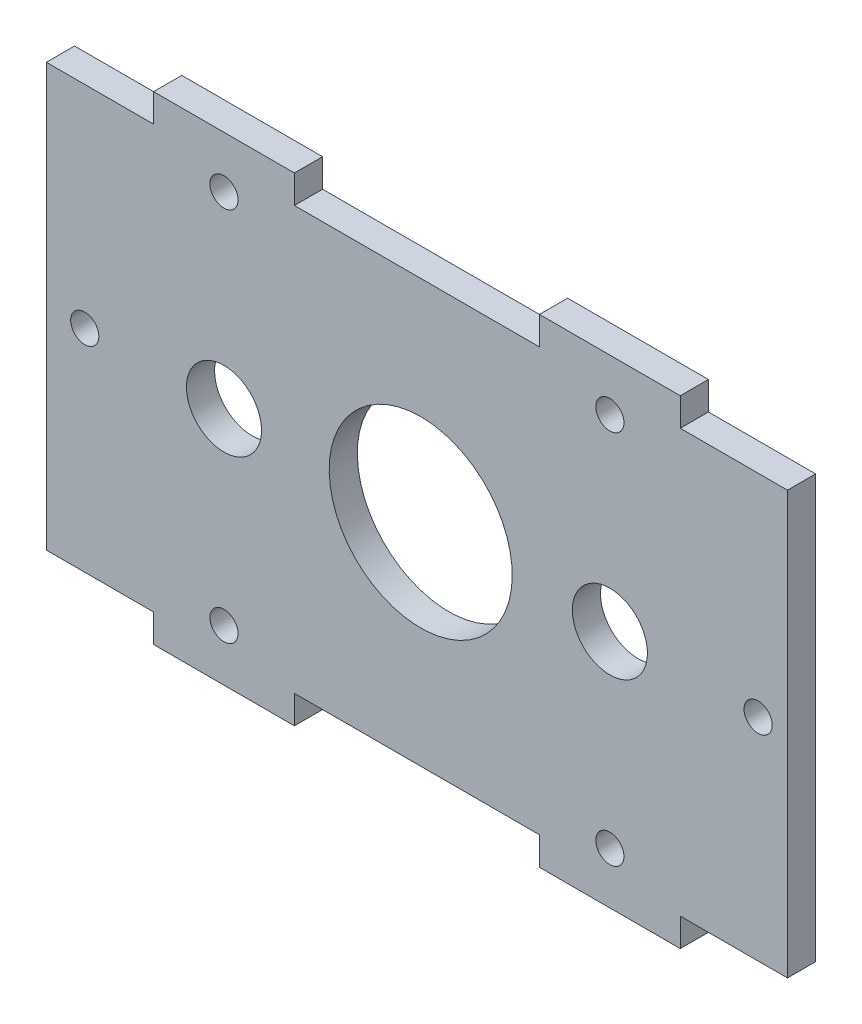
ISO-10303-21;
HEADER;
FILE_DESCRIPTION(('STEP AP214'),'2;1');
FILE_NAME('part.step','',(''),(''),'','','');
FILE_SCHEMA(('AUTOMOTIVE_DESIGN { 1 0 10303 214 1 1 1 1 }'));
ENDSEC;
DATA;
#1=APPLICATION_CONTEXT('core data for automotive mechanical design processes');
#2=APPLICATION_PROTOCOL_DEFINITION('international standard','automotive_design',2000,#1);
#3=PRODUCT_CONTEXT('',#1,'mechanical');
#4=PRODUCT('Part','Part','',(#3));
#5=PRODUCT_RELATED_PRODUCT_CATEGORY('part','',(#4));
#6=PRODUCT_DEFINITION_FORMATION('','',#4);
#7=PRODUCT_DEFINITION_CONTEXT('part definition',#1,'design');
#8=PRODUCT_DEFINITION('design','',#6,#7);
#9=PRODUCT_DEFINITION_SHAPE('','',#8);
#10=(LENGTH_UNIT() NAMED_UNIT(*) SI_UNIT(.MILLI.,.METRE.));
#11=(NAMED_UNIT(*) PLANE_ANGLE_UNIT() SI_UNIT($,.RADIAN.));
#12=(NAMED_UNIT(*) SI_UNIT($,.STERADIAN.) SOLID_ANGLE_UNIT());
#13=UNCERTAINTY_MEASURE_WITH_UNIT(LENGTH_MEASURE(1.E-05),#10,'distance_accuracy_value','');
#14=(GEOMETRIC_REPRESENTATION_CONTEXT(3) GLOBAL_UNCERTAINTY_ASSIGNED_CONTEXT((#13)) GLOBAL_UNIT_ASSIGNED_CONTEXT((#10,
#11,#12)) REPRESENTATION_CONTEXT('',''));
#15=CARTESIAN_POINT('',(0.,0.,0.));
#16=DIRECTION('',(0.,0.,1.));
#17=DIRECTION('',(1.,0.,0.));
#18=AXIS2_PLACEMENT_3D('',#15,#16,#17);
#19=CARTESIAN_POINT('',(-3336.50903802614,3419.69753015379,-74.1000733556906));
#20=DIRECTION('',(0.,0.,-1.));
#21=DIRECTION('',(0.,1.,0.));
#22=AXIS2_PLACEMENT_3D('',#19,#20,#21);
#23=PLANE('',#22);
#24=CARTESIAN_POINT('',(-3046.84162709748,2893.49823681851,-74.1000733556915));
#25=DIRECTION('',(0.,0.,-1.));
#26=DIRECTION('',(0.,1.,0.));
#27=AXIS2_PLACEMENT_3D('',#24,#25,#26);
#28=CIRCLE('',#27,9.74999999999994);
#29=CARTESIAN_POINT('',(-3046.84162709748,2903.24823681851,-74.1000733556915));
#30=VERTEX_POINT('',#29);
#31=EDGE_CURVE('E202',#30,#30,#28,.T.);
#32=ORIENTED_EDGE('',*,*,#31,.T.);
#33=EDGE_LOOP('',(#32));
#34=FACE_BOUND('',#33,.T.);
#35=CARTESIAN_POINT('',(-3026.69443963609,2873.49823681851,-74.1000733556914));
#36=DIRECTION('',(0.,0.,-1.));
#37=DIRECTION('',(0.,1.,0.));
#38=AXIS2_PLACEMENT_3D('',#35,#36,#37);
#39=CIRCLE('',#38,1.50000000000006);
#40=CARTESIAN_POINT('',(-3026.69443963609,2874.99823681851,-74.1000733556914));
#41=VERTEX_POINT('',#40);
#42=EDGE_CURVE('E205',#41,#41,#39,.T.);
#43=ORIENTED_EDGE('',*,*,#42,.T.);
#44=EDGE_LOOP('',(#43));
#45=FACE_BOUND('',#44,.T.);
#46=CARTESIAN_POINT('',(-3067.79673216073,2913.49823681851,-74.1000733556915));
#47=DIRECTION('',(0.,0.,-1.));
#48=DIRECTION('',(0.,1.,0.));
#49=AXIS2_PLACEMENT_3D('',#46,#47,#48);
#50=CIRCLE('',#49,1.50000000000006);
#51=CARTESIAN_POINT('',(-3067.79673216073,2914.99823681851,-74.1000733556915));
#52=VERTEX_POINT('',#51);
#53=EDGE_CURVE('E208',#52,#52,#50,.T.);
#54=ORIENTED_EDGE('',*,*,#53,.T.);
#55=EDGE_LOOP('',(#54));
#56=FACE_BOUND('',#55,.T.);
#57=CARTESIAN_POINT('',(-3067.79673216073,2873.49823681851,-74.1000733556914));
#58=DIRECTION('',(0.,0.,-1.));
#59=DIRECTION('',(0.,1.,0.));
#60=AXIS2_PLACEMENT_3D('',#57,#58,#59);
#61=CIRCLE('',#60,1.50000000000006);
#62=CARTESIAN_POINT('',(-3067.79673216073,2874.99823681851,-74.1000733556914));
#63=VERTEX_POINT('',#62);
#64=EDGE_CURVE('E211',#63,#63,#61,.T.);
#65=ORIENTED_EDGE('',*,*,#64,.T.);
#66=EDGE_LOOP('',(#65));
#67=FACE_BOUND('',#66,.T.);
#68=CARTESIAN_POINT('',(-3067.79673216073,2893.49823681851,-74.1000733556915));
#69=DIRECTION('',(0.,0.,-1.));
#70=DIRECTION('',(0.,1.,0.));
#71=AXIS2_PLACEMENT_3D('',#68,#69,#70);
#72=CIRCLE('',#71,4.00000000000006);
#73=CARTESIAN_POINT('',(-3067.79673216073,2897.49823681851,-74.1000733556915));
#74=VERTEX_POINT('',#73);
#75=EDGE_CURVE('E214',#74,#74,#72,.T.);
#76=ORIENTED_EDGE('',*,*,#75,.T.);
#77=EDGE_LOOP('',(#76));
#78=FACE_BOUND('',#77,.T.);
#79=CARTESIAN_POINT('',(-3026.69443963609,2913.49823681851,-74.1000733556915));
#80=DIRECTION('',(0.,0.,-1.));
#81=DIRECTION('',(0.,1.,0.));
#82=AXIS2_PLACEMENT_3D('',#79,#80,#81);
#83=CIRCLE('',#82,1.50000000000006);
#84=CARTESIAN_POINT('',(-3026.69443963609,2914.99823681851,-74.1000733556915));
#85=VERTEX_POINT('',#84);
#86=EDGE_CURVE('E217',#85,#85,#83,.T.);
#87=ORIENTED_EDGE('',*,*,#86,.T.);
#88=EDGE_LOOP('',(#87));
#89=FACE_BOUND('',#88,.T.);
#90=CARTESIAN_POINT('',(-3026.69443963609,2893.49823681851,-74.1000733556915));
#91=DIRECTION('',(0.,0.,-1.));
#92=DIRECTION('',(0.,1.,0.));
#93=AXIS2_PLACEMENT_3D('',#90,#91,#92);
#94=CIRCLE('',#93,4.00000000000006);
#95=CARTESIAN_POINT('',(-3026.69443963609,2897.49823681851,-74.1000733556915));
#96=VERTEX_POINT('',#95);
#97=EDGE_CURVE('E220',#96,#96,#94,.T.);
#98=ORIENTED_EDGE('',*,*,#97,.T.);
#99=EDGE_LOOP('',(#98));
#100=FACE_BOUND('',#99,.T.);
#101=CARTESIAN_POINT('',(-3082.62415480793,2893.4982368185,-74.1000733556915));
#102=DIRECTION('',(0.,0.,1.));
#103=DIRECTION('',(0.,-1.,0.));
#104=AXIS2_PLACEMENT_3D('',#101,#102,#103);
#105=CIRCLE('',#104,1.50000000000006);
#106=CARTESIAN_POINT('',(-3082.62415480793,2891.9982368185,-74.1000733556915));
#107=VERTEX_POINT('',#106);
#108=EDGE_CURVE('E222',#107,#107,#105,.F.);
#109=ORIENTED_EDGE('',*,*,#108,.T.);
#110=EDGE_LOOP('',(#109));
#111=FACE_BOUND('',#110,.T.);
#112=CARTESIAN_POINT('',(-3010.9051405861,2893.4982368185,-74.1000733556916));
#113=DIRECTION('',(0.,0.,1.));
#114=DIRECTION('',(0.,-1.,0.));
#115=AXIS2_PLACEMENT_3D('',#112,#113,#114);
#116=CIRCLE('',#115,1.50000000000006);
#117=CARTESIAN_POINT('',(-3010.9051405861,2891.9982368185,-74.1000733556916));
#118=VERTEX_POINT('',#117);
#119=EDGE_CURVE('E19',#118,#118,#116,.F.);
#120=ORIENTED_EDGE('',*,*,#119,.T.);
#121=EDGE_LOOP('',(#120));
#122=FACE_BOUND('',#121,.T.);
#123=DIRECTION('',(0.,1.,0.));
#124=VECTOR('',#123,1.);
#125=CARTESIAN_POINT('',(-3019.19589990855,2918.9982368185,-74.1000733556915));
#126=LINE('',#125,#124);
#127=CARTESIAN_POINT('',(-3019.19589990855,2918.9982368185,-74.1000733556915));
#128=VERTEX_POINT('',#127);
#129=CARTESIAN_POINT('',(-3019.19589990855,2915.99823681851,-74.1000733556915));
#130=VERTEX_POINT('',#129);
#131=EDGE_CURVE('E250',#128,#130,#126,.F.);
#132=ORIENTED_EDGE('',*,*,#131,.F.);
#133=DIRECTION('',(-1.,2.1227464230833E-13,0.));
#134=VECTOR('',#133,1.);
#135=CARTESIAN_POINT('',(-3034.19589990856,2918.9982368185,-74.1000733556915));
#136=LINE('',#135,#134);
#137=CARTESIAN_POINT('',(-3034.19589990856,2918.9982368185,-74.1000733556915));
#138=VERTEX_POINT('',#137);
#139=EDGE_CURVE('E256',#138,#128,#136,.F.);
#140=ORIENTED_EDGE('',*,*,#139,.F.);
#141=DIRECTION('',(0.,-1.,0.));
#142=VECTOR('',#141,1.);
#143=CARTESIAN_POINT('',(-3034.19589990856,2915.99823681851,-74.1000733556915));
#144=LINE('',#143,#142);
#145=CARTESIAN_POINT('',(-3034.19589990856,2915.9982368185,-74.1000733556915));
#146=VERTEX_POINT('',#145);
#147=EDGE_CURVE('E262',#146,#138,#144,.F.);
#148=ORIENTED_EDGE('',*,*,#147,.F.);
#149=DIRECTION('',(-1.,-1.56763491077072E-13,0.));
#150=VECTOR('',#149,1.);
#151=CARTESIAN_POINT('',(-3060.29527188827,2915.9982368185,-74.1000733556915));
#152=LINE('',#151,#150);
#153=CARTESIAN_POINT('',(-3060.29527188827,2915.9982368185,-74.1000733556915));
#154=VERTEX_POINT('',#153);
#155=EDGE_CURVE('E268',#154,#146,#152,.F.);
#156=ORIENTED_EDGE('',*,*,#155,.F.);
#157=DIRECTION('',(5.53390666624409E-13,1.,0.));
#158=VECTOR('',#157,1.);
#159=CARTESIAN_POINT('',(-3060.29527188827,2918.9982368185,-74.1000733556915));
#160=LINE('',#159,#158);
#161=CARTESIAN_POINT('',(-3060.29527188827,2918.9982368185,-74.1000733556915));
#162=VERTEX_POINT('',#161);
#163=EDGE_CURVE('E274',#162,#154,#160,.F.);
#164=ORIENTED_EDGE('',*,*,#163,.F.);
#165=DIRECTION('',(-1.,0.,0.));
#166=VECTOR('',#165,1.);
#167=CARTESIAN_POINT('',(-3075.29527188827,2918.9982368185,-74.1000733556915));
#168=LINE('',#167,#166);
#169=CARTESIAN_POINT('',(-3075.29527188827,2918.9982368185,-74.1000733556915));
#170=VERTEX_POINT('',#169);
#171=EDGE_CURVE('E280',#170,#162,#168,.F.);
#172=ORIENTED_EDGE('',*,*,#171,.F.);
#173=DIRECTION('',(0.,-1.,0.));
#174=VECTOR('',#173,1.);
#175=CARTESIAN_POINT('',(-3075.29527188827,2915.99823681851,-74.1000733556915));
#176=LINE('',#175,#174);
#177=CARTESIAN_POINT('',(-3075.29527188827,2915.99823681851,-74.1000733556915));
#178=VERTEX_POINT('',#177);
#179=EDGE_CURVE('E286',#178,#170,#176,.F.);
#180=ORIENTED_EDGE('',*,*,#179,.F.);
#181=DIRECTION('',(-1.,0.,0.));
#182=VECTOR('',#181,1.);
#183=CARTESIAN_POINT('',(-3084.71460012025,2915.99823681851,-74.1000733556915));
#184=LINE('',#183,#182);
#185=CARTESIAN_POINT('',(-3086.71460012025,2915.99823681851,-74.1000733556915));
#186=VERTEX_POINT('',#185);
#187=EDGE_CURVE('E292',#186,#178,#184,.F.);
#188=ORIENTED_EDGE('',*,*,#187,.F.);
#189=DIRECTION('',(0.,-1.,0.));
#190=VECTOR('',#189,1.);
#191=CARTESIAN_POINT('',(-3086.71460012025,2870.99823681851,-74.1000733556914));
#192=LINE('',#191,#190);
#193=CARTESIAN_POINT('',(-3086.71460012025,2870.99823681851,-74.1000733556915));
#194=VERTEX_POINT('',#193);
#195=EDGE_CURVE('E298',#194,#186,#192,.F.);
#196=ORIENTED_EDGE('',*,*,#195,.F.);
#197=DIRECTION('',(1.,-3.47055717497824E-13,0.));
#198=VECTOR('',#197,1.);
#199=CARTESIAN_POINT('',(-3075.29527188827,2870.99823681851,-74.1000733556914));
#200=LINE('',#199,#198);
#201=CARTESIAN_POINT('',(-3075.29527188827,2870.99823681851,-74.1000733556915));
#202=VERTEX_POINT('',#201);
#203=EDGE_CURVE('E304',#202,#194,#200,.F.);
#204=ORIENTED_EDGE('',*,*,#203,.F.);
#205=DIRECTION('',(0.,-1.,0.));
#206=VECTOR('',#205,1.);
#207=CARTESIAN_POINT('',(-3075.29527188827,2867.99823681852,-74.1000733556914));
#208=LINE('',#207,#206);
#209=CARTESIAN_POINT('',(-3075.29527188827,2867.99823681852,-74.1000733556915));
#210=VERTEX_POINT('',#209);
#211=EDGE_CURVE('E310',#210,#202,#208,.F.);
#212=ORIENTED_EDGE('',*,*,#211,.F.);
#213=DIRECTION('',(1.,0.,0.));
#214=VECTOR('',#213,1.);
#215=CARTESIAN_POINT('',(-3060.29527188827,2867.99823681852,-74.1000733556915));
#216=LINE('',#215,#214);
#217=CARTESIAN_POINT('',(-3060.29527188827,2867.99823681852,-74.1000733556915));
#218=VERTEX_POINT('',#217);
#219=EDGE_CURVE('E316',#218,#210,#216,.F.);
#220=ORIENTED_EDGE('',*,*,#219,.F.);
#221=DIRECTION('',(0.,1.,0.));
#222=VECTOR('',#221,1.);
#223=CARTESIAN_POINT('',(-3060.29527188827,2870.99823681851,-74.1000733556915));
#224=LINE('',#223,#222);
#225=CARTESIAN_POINT('',(-3060.29527188827,2870.99823681851,-74.1000733556915));
#226=VERTEX_POINT('',#225);
#227=EDGE_CURVE('E322',#226,#218,#224,.F.);
#228=ORIENTED_EDGE('',*,*,#227,.F.);
#229=DIRECTION('',(1.,1.45716771982052E-13,0.));
#230=VECTOR('',#229,1.);
#231=CARTESIAN_POINT('',(-3034.19589990856,2870.99823681851,-74.1000733556914));
#232=LINE('',#231,#230);
#233=CARTESIAN_POINT('',(-3034.19589990856,2870.99823681851,-74.1000733556915));
#234=VERTEX_POINT('',#233);
#235=EDGE_CURVE('E328',#234,#226,#232,.F.);
#236=ORIENTED_EDGE('',*,*,#235,.F.);
#237=DIRECTION('',(-6.4831473522986E-13,-1.,0.));
#238=VECTOR('',#237,1.);
#239=CARTESIAN_POINT('',(-3034.19589990856,2867.99823681851,-74.1000733556915));
#240=LINE('',#239,#238);
#241=CARTESIAN_POINT('',(-3034.19589990856,2867.99823681851,-74.1000733556915));
#242=VERTEX_POINT('',#241);
#243=EDGE_CURVE('E150',#242,#234,#240,.F.);
#244=ORIENTED_EDGE('',*,*,#243,.F.);
#245=DIRECTION('',(1.,0.,0.));
#246=VECTOR('',#245,1.);
#247=CARTESIAN_POINT('',(-3019.19589990856,2867.99823681851,-74.1000733556915));
#248=LINE('',#247,#246);
#249=CARTESIAN_POINT('',(-3019.19589990856,2867.99823681851,-74.1000733556915));
#250=VERTEX_POINT('',#249);
#251=EDGE_CURVE('E153',#250,#242,#248,.F.);
#252=ORIENTED_EDGE('',*,*,#251,.F.);
#253=DIRECTION('',(0.,1.,0.));
#254=VECTOR('',#253,1.);
#255=CARTESIAN_POINT('',(-3019.19589990856,2870.99823681851,-74.1000733556915));
#256=LINE('',#255,#254);
#257=CARTESIAN_POINT('',(-3019.19589990856,2870.99823681851,-74.1000733556916));
#258=VERTEX_POINT('',#257);
#259=EDGE_CURVE('E156',#258,#250,#256,.F.);
#260=ORIENTED_EDGE('',*,*,#259,.F.);
#261=DIRECTION('',(1.,0.,0.));
#262=VECTOR('',#261,1.);
#263=CARTESIAN_POINT('',(-3012.77657167658,2870.99823681851,-74.1000733556916));
#264=LINE('',#263,#262);
#265=CARTESIAN_POINT('',(-3007.77657167658,2870.99823681851,-74.1000733556915));
#266=VERTEX_POINT('',#265);
#267=EDGE_CURVE('E227',#266,#258,#264,.F.);
#268=ORIENTED_EDGE('',*,*,#267,.F.);
#269=DIRECTION('',(0.,1.,0.));
#270=VECTOR('',#269,1.);
#271=CARTESIAN_POINT('',(-3007.77657167658,2912.9982368185,-74.1000733556915));
#272=LINE('',#271,#270);
#273=CARTESIAN_POINT('',(-3007.77657167658,2915.9982368185,-74.1000733556915));
#274=VERTEX_POINT('',#273);
#275=EDGE_CURVE('E237',#274,#266,#272,.F.);
#276=ORIENTED_EDGE('',*,*,#275,.F.);
#277=DIRECTION('',(-1.,5.6049609398201E-13,0.));
#278=VECTOR('',#277,1.);
#279=CARTESIAN_POINT('',(-3019.19589990856,2915.99823681851,-74.1000733556915));
#280=LINE('',#279,#278);
#281=EDGE_CURVE('E242',#130,#274,#280,.F.);
#282=ORIENTED_EDGE('',*,*,#281,.F.);
#283=EDGE_LOOP('',(#132,#140,#148,#156,#164,#172,#180,#188,#196,#204,#212,#220,#228,#236,#244,
#252,#260,#268,#276,#282));
#284=FACE_BOUND('',#283,.T.);
#285=ADVANCED_FACE('F16',(#34,#45,#56,#67,#78,#89,#100,#111,#122,#284),#23,.F.);
#286=CARTESIAN_POINT('',(-3019.19589990856,2870.99823681851,-74.1000733556915));
#287=DIRECTION('',(1.,0.,0.));
#288=DIRECTION('',(0.,1.,0.));
#289=AXIS2_PLACEMENT_3D('',#286,#287,#288);
#290=PLANE('',#289);
#291=DIRECTION('',(0.,1.,0.));
#292=VECTOR('',#291,1.);
#293=CARTESIAN_POINT('',(-3019.19589990856,3419.69753015379,-77.1000733556909));
#294=LINE('',#293,#292);
#295=CARTESIAN_POINT('',(-3019.19589990856,2870.99823681851,-77.1000733556915));
#296=VERTEX_POINT('',#295);
#297=CARTESIAN_POINT('',(-3019.19589990856,2867.99823681851,-77.1000733556915));
#298=VERTEX_POINT('',#297);
#299=EDGE_CURVE('E342',#296,#298,#294,.F.);
#300=ORIENTED_EDGE('',*,*,#299,.F.);
#301=DIRECTION('',(0.,0.,1.));
#302=VECTOR('',#301,1.);
#303=CARTESIAN_POINT('',(-3019.19589990856,2870.99823681851,-74.1000733567765));
#304=LINE('',#303,#302);
#305=EDGE_CURVE('E167',#258,#296,#304,.F.);
#306=ORIENTED_EDGE('',*,*,#305,.F.);
#307=ORIENTED_EDGE('',*,*,#259,.T.);
#308=DIRECTION('',(0.,0.,1.));
#309=VECTOR('',#308,1.);
#310=CARTESIAN_POINT('',(-3019.19589990856,2867.99823681851,-74.1000733556915));
#311=LINE('',#310,#309);
#312=EDGE_CURVE('E161',#298,#250,#311,.T.);
#313=ORIENTED_EDGE('',*,*,#312,.F.);
#314=EDGE_LOOP('',(#300,#306,#307,#313));
#315=FACE_BOUND('',#314,.T.);
#316=ADVANCED_FACE('F165',(#315),#290,.T.);
#317=CARTESIAN_POINT('',(-3019.19589990856,2867.99823681851,-74.1000733556915));
#318=DIRECTION('',(0.,-1.,0.));
#319=DIRECTION('',(1.,0.,0.));
#320=AXIS2_PLACEMENT_3D('',#317,#318,#319);
#321=PLANE('',#320);
#322=DIRECTION('',(1.,0.,0.));
#323=VECTOR('',#322,1.);
#324=CARTESIAN_POINT('',(-3336.50903802614,2867.99823681851,-77.1000733556915));
#325=LINE('',#324,#323);
#326=CARTESIAN_POINT('',(-3034.19589990856,2867.99823681851,-77.1000733556915));
#327=VERTEX_POINT('',#326);
#328=EDGE_CURVE('E171',#298,#327,#325,.F.);
#329=ORIENTED_EDGE('',*,*,#328,.F.);
#330=ORIENTED_EDGE('',*,*,#312,.T.);
#331=ORIENTED_EDGE('',*,*,#251,.T.);
#332=DIRECTION('',(0.,0.,1.));
#333=VECTOR('',#332,1.);
#334=CARTESIAN_POINT('',(-3034.19589990856,2867.99823681851,-74.1000733556915));
#335=LINE('',#334,#333);
#336=EDGE_CURVE('E174',#327,#242,#335,.T.);
#337=ORIENTED_EDGE('',*,*,#336,.F.);
#338=EDGE_LOOP('',(#329,#330,#331,#337));
#339=FACE_BOUND('',#338,.T.);
#340=ADVANCED_FACE('F169',(#339),#321,.T.);
#341=CARTESIAN_POINT('',(-3034.19589990856,2867.99823681851,-74.1000733556915));
#342=DIRECTION('',(-1.,6.4831473522986E-13,0.));
#343=DIRECTION('',(-6.4831473522986E-13,-1.,0.));
#344=AXIS2_PLACEMENT_3D('',#341,#342,#343);
#345=PLANE('',#344);
#346=DIRECTION('',(0.,1.,0.));
#347=VECTOR('',#346,1.);
#348=CARTESIAN_POINT('',(-3034.19589990856,3419.69753015379,-77.1000733556909));
#349=LINE('',#348,#347);
#350=CARTESIAN_POINT('',(-3034.19589990856,2870.99823681851,-77.1000733556915));
#351=VERTEX_POINT('',#350);
#352=EDGE_CURVE('E334',#327,#351,#349,.T.);
#353=ORIENTED_EDGE('',*,*,#352,.F.);
#354=ORIENTED_EDGE('',*,*,#336,.T.);
#355=ORIENTED_EDGE('',*,*,#243,.T.);
#356=DIRECTION('',(0.,0.,1.));
#357=VECTOR('',#356,1.);
#358=CARTESIAN_POINT('',(-3034.19589990856,2870.99823681851,-74.1000733556914));
#359=LINE('',#358,#357);
#360=EDGE_CURVE('E325',#351,#234,#359,.T.);
#361=ORIENTED_EDGE('',*,*,#360,.F.);
#362=EDGE_LOOP('',(#353,#354,#355,#361));
#363=FACE_BOUND('',#362,.T.);
#364=ADVANCED_FACE('F332',(#363),#345,.T.);
#365=CARTESIAN_POINT('',(-3034.19589990856,2870.99823681851,-74.1000733556914));
#366=DIRECTION('',(1.45716771982052E-13,-1.,0.));
#367=DIRECTION('',(1.,1.45716771982052E-13,0.));
#368=AXIS2_PLACEMENT_3D('',#365,#366,#367);
#369=PLANE('',#368);
#370=DIRECTION('',(1.,0.,0.));
#371=VECTOR('',#370,1.);
#372=CARTESIAN_POINT('',(-3336.50903802614,2870.99823681851,-77.1000733556915));
#373=LINE('',#372,#371);
#374=CARTESIAN_POINT('',(-3060.29527188827,2870.99823681851,-77.1000733556915));
#375=VERTEX_POINT('',#374);
#376=EDGE_CURVE('E338',#351,#375,#373,.F.);
#377=ORIENTED_EDGE('',*,*,#376,.F.);
#378=ORIENTED_EDGE('',*,*,#360,.T.);
#379=ORIENTED_EDGE('',*,*,#235,.T.);
#380=DIRECTION('',(0.,0.,1.));
#381=VECTOR('',#380,1.);
#382=CARTESIAN_POINT('',(-3060.29527188827,2870.99823681851,-74.1000733556915));
#383=LINE('',#382,#381);
#384=EDGE_CURVE('E319',#375,#226,#383,.T.);
#385=ORIENTED_EDGE('',*,*,#384,.F.);
#386=EDGE_LOOP('',(#377,#378,#379,#385));
#387=FACE_BOUND('',#386,.T.);
#388=ADVANCED_FACE('F647',(#387),#369,.T.);
#389=CARTESIAN_POINT('',(-3060.29527188827,2870.99823681851,-74.1000733556915));
#390=DIRECTION('',(1.,0.,0.));
#391=DIRECTION('',(0.,1.,0.));
#392=AXIS2_PLACEMENT_3D('',#389,#390,#391);
#393=PLANE('',#392);
#394=DIRECTION('',(0.,1.,0.));
#395=VECTOR('',#394,1.);
#396=CARTESIAN_POINT('',(-3060.29527188827,3419.69753015379,-77.1000733556909));
#397=LINE('',#396,#395);
#398=CARTESIAN_POINT('',(-3060.29527188827,2867.99823681852,-77.1000733556915));
#399=VERTEX_POINT('',#398);
#400=EDGE_CURVE('E346',#375,#399,#397,.F.);
#401=ORIENTED_EDGE('',*,*,#400,.F.);
#402=ORIENTED_EDGE('',*,*,#384,.T.);
#403=ORIENTED_EDGE('',*,*,#227,.T.);
#404=DIRECTION('',(0.,0.,1.));
#405=VECTOR('',#404,1.);
#406=CARTESIAN_POINT('',(-3060.29527188827,2867.99823681852,-74.1000733556915));
#407=LINE('',#406,#405);
#408=EDGE_CURVE('E313',#399,#218,#407,.T.);
#409=ORIENTED_EDGE('',*,*,#408,.F.);
#410=EDGE_LOOP('',(#401,#402,#403,#409));
#411=FACE_BOUND('',#410,.T.);
#412=ADVANCED_FACE('F638',(#411),#393,.T.);
#413=CARTESIAN_POINT('',(-3060.29527188827,2867.99823681852,-74.1000733556915));
#414=DIRECTION('',(0.,-1.,0.));
#415=DIRECTION('',(1.,0.,0.));
#416=AXIS2_PLACEMENT_3D('',#413,#414,#415);
#417=PLANE('',#416);
#418=DIRECTION('',(1.,0.,0.));
#419=VECTOR('',#418,1.);
#420=CARTESIAN_POINT('',(-3336.50903802614,2867.99823681852,-77.1000733556915));
#421=LINE('',#420,#419);
#422=CARTESIAN_POINT('',(-3075.29527188827,2867.99823681852,-77.1000733556915));
#423=VERTEX_POINT('',#422);
#424=EDGE_CURVE('E349',#399,#423,#421,.F.);
#425=ORIENTED_EDGE('',*,*,#424,.F.);
#426=ORIENTED_EDGE('',*,*,#408,.T.);
#427=ORIENTED_EDGE('',*,*,#219,.T.);
#428=DIRECTION('',(0.,0.,1.));
#429=VECTOR('',#428,1.);
#430=CARTESIAN_POINT('',(-3075.29527188827,2867.99823681852,-74.1000733556914));
#431=LINE('',#430,#429);
#432=EDGE_CURVE('E307',#423,#210,#431,.T.);
#433=ORIENTED_EDGE('',*,*,#432,.F.);
#434=EDGE_LOOP('',(#425,#426,#427,#433));
#435=FACE_BOUND('',#434,.T.);
#436=ADVANCED_FACE('F629',(#435),#417,.T.);
#437=CARTESIAN_POINT('',(-3075.29527188827,2867.99823681852,-74.1000733556914));
#438=DIRECTION('',(-1.,0.,0.));
#439=DIRECTION('',(0.,-1.,0.));
#440=AXIS2_PLACEMENT_3D('',#437,#438,#439);
#441=PLANE('',#440);
#442=DIRECTION('',(0.,1.,0.));
#443=VECTOR('',#442,1.);
#444=CARTESIAN_POINT('',(-3075.29527188827,3419.69753015379,-77.1000733556909));
#445=LINE('',#444,#443);
#446=CARTESIAN_POINT('',(-3075.29527188827,2870.99823681851,-77.1000733556915));
#447=VERTEX_POINT('',#446);
#448=EDGE_CURVE('E352',#423,#447,#445,.T.);
#449=ORIENTED_EDGE('',*,*,#448,.F.);
#450=ORIENTED_EDGE('',*,*,#432,.T.);
#451=ORIENTED_EDGE('',*,*,#211,.T.);
#452=DIRECTION('',(0.,0.,1.));
#453=VECTOR('',#452,1.);
#454=CARTESIAN_POINT('',(-3075.29527188827,2870.99823681851,-74.1000733556914));
#455=LINE('',#454,#453);
#456=EDGE_CURVE('E301',#447,#202,#455,.T.);
#457=ORIENTED_EDGE('',*,*,#456,.F.);
#458=EDGE_LOOP('',(#449,#450,#451,#457));
#459=FACE_BOUND('',#458,.T.);
#460=ADVANCED_FACE('F620',(#459),#441,.T.);
#461=CARTESIAN_POINT('',(-3075.29527188827,2870.99823681851,-74.1000733556914));
#462=DIRECTION('',(-3.47055717497824E-13,-1.,0.));
#463=DIRECTION('',(1.,-3.47055717497824E-13,0.));
#464=AXIS2_PLACEMENT_3D('',#461,#462,#463);
#465=PLANE('',#464);
#466=DIRECTION('',(1.,0.,0.));
#467=VECTOR('',#466,1.);
#468=CARTESIAN_POINT('',(-3336.50903802614,2870.99823681851,-77.1000733556915));
#469=LINE('',#468,#467);
#470=CARTESIAN_POINT('',(-3086.71460012025,2870.99823681851,-77.1000733556915));
#471=VERTEX_POINT('',#470);
#472=EDGE_CURVE('E355',#447,#471,#469,.F.);
#473=ORIENTED_EDGE('',*,*,#472,.F.);
#474=ORIENTED_EDGE('',*,*,#456,.T.);
#475=ORIENTED_EDGE('',*,*,#203,.T.);
#476=DIRECTION('',(0.,0.,1.));
#477=VECTOR('',#476,1.);
#478=CARTESIAN_POINT('',(-3086.71460012025,2870.99823681851,-74.1000733556914));
#479=LINE('',#478,#477);
#480=EDGE_CURVE('E295',#471,#194,#479,.T.);
#481=ORIENTED_EDGE('',*,*,#480,.F.);
#482=EDGE_LOOP('',(#473,#474,#475,#481));
#483=FACE_BOUND('',#482,.T.);
#484=ADVANCED_FACE('F611',(#483),#465,.T.);
#485=CARTESIAN_POINT('',(-3086.71460012025,2870.99823681851,-74.1000733556914));
#486=DIRECTION('',(-1.,0.,0.));
#487=DIRECTION('',(0.,-1.,0.));
#488=AXIS2_PLACEMENT_3D('',#485,#486,#487);
#489=PLANE('',#488);
#490=DIRECTION('',(0.,1.,0.));
#491=VECTOR('',#490,1.);
#492=CARTESIAN_POINT('',(-3086.71460012025,3419.69753015379,-77.1000733556909));
#493=LINE('',#492,#491);
#494=CARTESIAN_POINT('',(-3086.71460012025,2915.99823681851,-77.1000733556914));
#495=VERTEX_POINT('',#494);
#496=EDGE_CURVE('E358',#471,#495,#493,.T.);
#497=ORIENTED_EDGE('',*,*,#496,.F.);
#498=ORIENTED_EDGE('',*,*,#480,.T.);
#499=ORIENTED_EDGE('',*,*,#195,.T.);
#500=DIRECTION('',(0.,0.,1.));
#501=VECTOR('',#500,1.);
#502=CARTESIAN_POINT('',(-3086.71460012025,2915.99823681851,-74.1000733556915));
#503=LINE('',#502,#501);
#504=EDGE_CURVE('E289',#495,#186,#503,.T.);
#505=ORIENTED_EDGE('',*,*,#504,.F.);
#506=EDGE_LOOP('',(#497,#498,#499,#505));
#507=FACE_BOUND('',#506,.T.);
#508=ADVANCED_FACE('F602',(#507),#489,.T.);
#509=CARTESIAN_POINT('',(-3084.71460012025,2915.99823681851,-74.1000733556915));
#510=DIRECTION('',(0.,1.,0.));
#511=DIRECTION('',(-1.,0.,0.));
#512=AXIS2_PLACEMENT_3D('',#509,#510,#511);
#513=PLANE('',#512);
#514=DIRECTION('',(1.,0.,0.));
#515=VECTOR('',#514,1.);
#516=CARTESIAN_POINT('',(-3336.50903802614,2915.99823681851,-77.1000733556914));
#517=LINE('',#516,#515);
#518=CARTESIAN_POINT('',(-3075.29527188827,2915.99823681851,-77.1000733556914));
#519=VERTEX_POINT('',#518);
#520=EDGE_CURVE('E361',#495,#519,#517,.T.);
#521=ORIENTED_EDGE('',*,*,#520,.F.);
#522=ORIENTED_EDGE('',*,*,#504,.T.);
#523=ORIENTED_EDGE('',*,*,#187,.T.);
#524=DIRECTION('',(0.,0.,1.));
#525=VECTOR('',#524,1.);
#526=CARTESIAN_POINT('',(-3075.29527188827,2915.99823681851,-74.1000733556915));
#527=LINE('',#526,#525);
#528=EDGE_CURVE('E283',#519,#178,#527,.T.);
#529=ORIENTED_EDGE('',*,*,#528,.F.);
#530=EDGE_LOOP('',(#521,#522,#523,#529));
#531=FACE_BOUND('',#530,.T.);
#532=ADVANCED_FACE('F593',(#531),#513,.T.);
#533=CARTESIAN_POINT('',(-3075.29527188827,2915.99823681851,-74.1000733556915));
#534=DIRECTION('',(-1.,0.,0.));
#535=DIRECTION('',(0.,-1.,0.));
#536=AXIS2_PLACEMENT_3D('',#533,#534,#535);
#537=PLANE('',#536);
#538=DIRECTION('',(0.,1.,0.));
#539=VECTOR('',#538,1.);
#540=CARTESIAN_POINT('',(-3075.29527188827,3419.69753015379,-77.1000733556909));
#541=LINE('',#540,#539);
#542=CARTESIAN_POINT('',(-3075.29527188827,2918.9982368185,-77.1000733556915));
#543=VERTEX_POINT('',#542);
#544=EDGE_CURVE('E364',#519,#543,#541,.T.);
#545=ORIENTED_EDGE('',*,*,#544,.F.);
#546=ORIENTED_EDGE('',*,*,#528,.T.);
#547=ORIENTED_EDGE('',*,*,#179,.T.);
#548=DIRECTION('',(0.,0.,1.));
#549=VECTOR('',#548,1.);
#550=CARTESIAN_POINT('',(-3075.29527188827,2918.9982368185,-74.1000733556915));
#551=LINE('',#550,#549);
#552=EDGE_CURVE('E277',#543,#170,#551,.T.);
#553=ORIENTED_EDGE('',*,*,#552,.F.);
#554=EDGE_LOOP('',(#545,#546,#547,#553));
#555=FACE_BOUND('',#554,.T.);
#556=ADVANCED_FACE('F584',(#555),#537,.T.);
#557=CARTESIAN_POINT('',(-3075.29527188827,2918.9982368185,-74.1000733556915));
#558=DIRECTION('',(0.,1.,0.));
#559=DIRECTION('',(-1.,0.,0.));
#560=AXIS2_PLACEMENT_3D('',#557,#558,#559);
#561=PLANE('',#560);
#562=DIRECTION('',(1.,0.,0.));
#563=VECTOR('',#562,1.);
#564=CARTESIAN_POINT('',(-3336.50903802614,2918.9982368185,-77.1000733556914));
#565=LINE('',#564,#563);
#566=CARTESIAN_POINT('',(-3060.29527188827,2918.9982368185,-77.1000733556915));
#567=VERTEX_POINT('',#566);
#568=EDGE_CURVE('E367',#543,#567,#565,.T.);
#569=ORIENTED_EDGE('',*,*,#568,.F.);
#570=ORIENTED_EDGE('',*,*,#552,.T.);
#571=ORIENTED_EDGE('',*,*,#171,.T.);
#572=DIRECTION('',(0.,0.,1.));
#573=VECTOR('',#572,1.);
#574=CARTESIAN_POINT('',(-3060.29527188827,2918.9982368185,-74.1000733556915));
#575=LINE('',#574,#573);
#576=EDGE_CURVE('E271',#567,#162,#575,.T.);
#577=ORIENTED_EDGE('',*,*,#576,.F.);
#578=EDGE_LOOP('',(#569,#570,#571,#577));
#579=FACE_BOUND('',#578,.T.);
#580=ADVANCED_FACE('F575',(#579),#561,.T.);
#581=CARTESIAN_POINT('',(-3060.29527188827,2918.9982368185,-74.1000733556915));
#582=DIRECTION('',(1.,-5.53390666624409E-13,0.));
#583=DIRECTION('',(5.53390666624409E-13,1.,0.));
#584=AXIS2_PLACEMENT_3D('',#581,#582,#583);
#585=PLANE('',#584);
#586=DIRECTION('',(0.,1.,0.));
#587=VECTOR('',#586,1.);
#588=CARTESIAN_POINT('',(-3060.29527188827,3419.69753015379,-77.1000733556909));
#589=LINE('',#588,#587);
#590=CARTESIAN_POINT('',(-3060.29527188827,2915.9982368185,-77.1000733556915));
#591=VERTEX_POINT('',#590);
#592=EDGE_CURVE('E370',#567,#591,#589,.F.);
#593=ORIENTED_EDGE('',*,*,#592,.F.);
#594=ORIENTED_EDGE('',*,*,#576,.T.);
#595=ORIENTED_EDGE('',*,*,#163,.T.);
#596=DIRECTION('',(0.,0.,1.));
#597=VECTOR('',#596,1.);
#598=CARTESIAN_POINT('',(-3060.29527188827,2915.9982368185,-74.1000733556915));
#599=LINE('',#598,#597);
#600=EDGE_CURVE('E265',#591,#154,#599,.T.);
#601=ORIENTED_EDGE('',*,*,#600,.F.);
#602=EDGE_LOOP('',(#593,#594,#595,#601));
#603=FACE_BOUND('',#602,.T.);
#604=ADVANCED_FACE('F566',(#603),#585,.T.);
#605=CARTESIAN_POINT('',(-3060.29527188827,2915.9982368185,-74.1000733556915));
#606=DIRECTION('',(-1.56763491077072E-13,1.,0.));
#607=DIRECTION('',(-1.,-1.56763491077072E-13,0.));
#608=AXIS2_PLACEMENT_3D('',#605,#606,#607);
#609=PLANE('',#608);
#610=DIRECTION('',(1.,0.,0.));
#611=VECTOR('',#610,1.);
#612=CARTESIAN_POINT('',(-3336.50903802614,2915.9982368185,-77.1000733556914));
#613=LINE('',#612,#611);
#614=CARTESIAN_POINT('',(-3034.19589990856,2915.9982368185,-77.1000733556915));
#615=VERTEX_POINT('',#614);
#616=EDGE_CURVE('E373',#591,#615,#613,.T.);
#617=ORIENTED_EDGE('',*,*,#616,.F.);
#618=ORIENTED_EDGE('',*,*,#600,.T.);
#619=ORIENTED_EDGE('',*,*,#155,.T.);
#620=DIRECTION('',(0.,0.,1.));
#621=VECTOR('',#620,1.);
#622=CARTESIAN_POINT('',(-3034.19589990856,2915.99823681851,-74.1000733556915));
#623=LINE('',#622,#621);
#624=EDGE_CURVE('E259',#615,#146,#623,.T.);
#625=ORIENTED_EDGE('',*,*,#624,.F.);
#626=EDGE_LOOP('',(#617,#618,#619,#625));
#627=FACE_BOUND('',#626,.T.);
#628=ADVANCED_FACE('F557',(#627),#609,.T.);
#629=CARTESIAN_POINT('',(-3034.19589990856,2915.99823681851,-74.1000733556915));
#630=DIRECTION('',(-1.,0.,0.));
#631=DIRECTION('',(0.,-1.,0.));
#632=AXIS2_PLACEMENT_3D('',#629,#630,#631);
#633=PLANE('',#632);
#634=DIRECTION('',(0.,1.,0.));
#635=VECTOR('',#634,1.);
#636=CARTESIAN_POINT('',(-3034.19589990856,3419.69753015379,-77.1000733556909));
#637=LINE('',#636,#635);
#638=CARTESIAN_POINT('',(-3034.19589990856,2918.9982368185,-77.1000733556915));
#639=VERTEX_POINT('',#638);
#640=EDGE_CURVE('E376',#615,#639,#637,.T.);
#641=ORIENTED_EDGE('',*,*,#640,.F.);
#642=ORIENTED_EDGE('',*,*,#624,.T.);
#643=ORIENTED_EDGE('',*,*,#147,.T.);
#644=DIRECTION('',(0.,0.,1.));
#645=VECTOR('',#644,1.);
#646=CARTESIAN_POINT('',(-3034.19589990856,2918.9982368185,-74.1000733556915));
#647=LINE('',#646,#645);
#648=EDGE_CURVE('E253',#639,#138,#647,.T.);
#649=ORIENTED_EDGE('',*,*,#648,.F.);
#650=EDGE_LOOP('',(#641,#642,#643,#649));
#651=FACE_BOUND('',#650,.T.);
#652=ADVANCED_FACE('F548',(#651),#633,.T.);
#653=CARTESIAN_POINT('',(-3034.19589990856,2918.9982368185,-74.1000733556915));
#654=DIRECTION('',(2.1227464230833E-13,1.,0.));
#655=DIRECTION('',(-1.,2.1227464230833E-13,0.));
#656=AXIS2_PLACEMENT_3D('',#653,#654,#655);
#657=PLANE('',#656);
#658=DIRECTION('',(1.,0.,0.));
#659=VECTOR('',#658,1.);
#660=CARTESIAN_POINT('',(-3336.50903802614,2918.9982368185,-77.1000733556914));
#661=LINE('',#660,#659);
#662=CARTESIAN_POINT('',(-3019.19589990855,2918.9982368185,-77.1000733556915));
#663=VERTEX_POINT('',#662);
#664=EDGE_CURVE('E379',#639,#663,#661,.T.);
#665=ORIENTED_EDGE('',*,*,#664,.F.);
#666=ORIENTED_EDGE('',*,*,#648,.T.);
#667=ORIENTED_EDGE('',*,*,#139,.T.);
#668=DIRECTION('',(0.,0.,1.));
#669=VECTOR('',#668,1.);
#670=CARTESIAN_POINT('',(-3019.19589990855,2918.9982368185,-74.1000733556915));
#671=LINE('',#670,#669);
#672=EDGE_CURVE('E247',#663,#128,#671,.T.);
#673=ORIENTED_EDGE('',*,*,#672,.F.);
#674=EDGE_LOOP('',(#665,#666,#667,#673));
#675=FACE_BOUND('',#674,.T.);
#676=ADVANCED_FACE('F539',(#675),#657,.T.);
#677=CARTESIAN_POINT('',(-3019.19589990855,2918.9982368185,-74.1000733556915));
#678=DIRECTION('',(1.,0.,0.));
#679=DIRECTION('',(0.,1.,0.));
#680=AXIS2_PLACEMENT_3D('',#677,#678,#679);
#681=PLANE('',#680);
#682=DIRECTION('',(0.,1.,0.));
#683=VECTOR('',#682,1.);
#684=CARTESIAN_POINT('',(-3019.19589990855,3419.69753015379,-77.1000733556909));
#685=LINE('',#684,#683);
#686=CARTESIAN_POINT('',(-3019.19589990855,2915.99823681851,-77.1000733556915));
#687=VERTEX_POINT('',#686);
#688=EDGE_CURVE('E382',#663,#687,#685,.F.);
#689=ORIENTED_EDGE('',*,*,#688,.F.);
#690=ORIENTED_EDGE('',*,*,#672,.T.);
#691=ORIENTED_EDGE('',*,*,#131,.T.);
#692=DIRECTION('',(0.,0.,1.));
#693=VECTOR('',#692,1.);
#694=CARTESIAN_POINT('',(-3019.19589990856,2915.99823681851,-74.1000733556915));
#695=LINE('',#694,#693);
#696=EDGE_CURVE('E244',#687,#130,#695,.T.);
#697=ORIENTED_EDGE('',*,*,#696,.F.);
#698=EDGE_LOOP('',(#689,#690,#691,#697));
#699=FACE_BOUND('',#698,.T.);
#700=ADVANCED_FACE('F530',(#699),#681,.T.);
#701=CARTESIAN_POINT('',(-3019.19589990856,2915.99823681851,-74.1000733556915));
#702=DIRECTION('',(5.6049609398201E-13,1.,0.));
#703=DIRECTION('',(-1.,5.6049609398201E-13,0.));
#704=AXIS2_PLACEMENT_3D('',#701,#702,#703);
#705=PLANE('',#704);
#706=DIRECTION('',(0.,0.,1.));
#707=VECTOR('',#706,1.);
#708=CARTESIAN_POINT('',(-3007.77657167658,2915.9982368185,-74.1000733567764));
#709=LINE('',#708,#707);
#710=CARTESIAN_POINT('',(-3007.77657167658,2915.9982368185,-77.1000733556916));
#711=VERTEX_POINT('',#710);
#712=EDGE_CURVE('E239',#711,#274,#709,.T.);
#713=ORIENTED_EDGE('',*,*,#712,.F.);
#714=DIRECTION('',(1.,0.,0.));
#715=VECTOR('',#714,1.);
#716=CARTESIAN_POINT('',(-3336.50903802614,2915.99823681851,-77.1000733556914));
#717=LINE('',#716,#715);
#718=EDGE_CURVE('E385',#687,#711,#717,.T.);
#719=ORIENTED_EDGE('',*,*,#718,.F.);
#720=ORIENTED_EDGE('',*,*,#696,.T.);
#721=ORIENTED_EDGE('',*,*,#281,.T.);
#722=EDGE_LOOP('',(#713,#719,#720,#721));
#723=FACE_BOUND('',#722,.T.);
#724=ADVANCED_FACE('F405',(#723),#705,.T.);
#725=CARTESIAN_POINT('',(-3007.77657167658,2912.9982368185,-74.1000733567764));
#726=DIRECTION('',(1.,0.,0.));
#727=DIRECTION('',(0.,1.,0.));
#728=AXIS2_PLACEMENT_3D('',#725,#726,#727);
#729=PLANE('',#728);
#730=ORIENTED_EDGE('',*,*,#275,.T.);
#731=DIRECTION('',(0.,0.,1.));
#732=VECTOR('',#731,1.);
#733=CARTESIAN_POINT('',(-3007.77657167658,2870.99823681851,-74.1000733567765));
#734=LINE('',#733,#732);
#735=CARTESIAN_POINT('',(-3007.77657167658,2870.99823681851,-77.1000733556916));
#736=VERTEX_POINT('',#735);
#737=EDGE_CURVE('E230',#736,#266,#734,.T.);
#738=ORIENTED_EDGE('',*,*,#737,.F.);
#739=DIRECTION('',(0.,1.,0.));
#740=VECTOR('',#739,1.);
#741=CARTESIAN_POINT('',(-3007.77657167658,3419.69753015379,-77.1000733556909));
#742=LINE('',#741,#740);
#743=EDGE_CURVE('E201',#711,#736,#742,.F.);
#744=ORIENTED_EDGE('',*,*,#743,.F.);
#745=ORIENTED_EDGE('',*,*,#712,.T.);
#746=EDGE_LOOP('',(#730,#738,#744,#745));
#747=FACE_BOUND('',#746,.T.);
#748=ADVANCED_FACE('F391',(#747),#729,.T.);
#749=CARTESIAN_POINT('',(-3012.77657167658,2870.99823681851,-74.1000733567765));
#750=DIRECTION('',(0.,-1.,0.));
#751=DIRECTION('',(1.,0.,0.));
#752=AXIS2_PLACEMENT_3D('',#749,#750,#751);
#753=PLANE('',#752);
#754=ORIENTED_EDGE('',*,*,#737,.T.);
#755=ORIENTED_EDGE('',*,*,#267,.T.);
#756=ORIENTED_EDGE('',*,*,#305,.T.);
#757=DIRECTION('',(1.,0.,0.));
#758=VECTOR('',#757,1.);
#759=CARTESIAN_POINT('',(-3336.50903802614,2870.99823681851,-77.1000733556915));
#760=LINE('',#759,#758);
#761=EDGE_CURVE('E34',#736,#296,#760,.F.);
#762=ORIENTED_EDGE('',*,*,#761,.F.);
#763=EDGE_LOOP('',(#754,#755,#756,#762));
#764=FACE_BOUND('',#763,.T.);
#765=ADVANCED_FACE('F393',(#764),#753,.T.);
#766=CARTESIAN_POINT('',(-3010.9051405861,2893.4982368185,-100.100073355699));
#767=DIRECTION('',(0.,0.,1.));
#768=DIRECTION('',(0.,-1.,0.));
#769=AXIS2_PLACEMENT_3D('',#766,#767,#768);
#770=CYLINDRICAL_SURFACE('',#769,1.50000000000006);
#771=ORIENTED_EDGE('',*,*,#119,.F.);
#772=EDGE_LOOP('',(#771));
#773=FACE_BOUND('',#772,.T.);
#774=CARTESIAN_POINT('',(-3010.9051405861,2893.4982368185,-77.1000733556917));
#775=DIRECTION('',(0.,0.,1.));
#776=DIRECTION('',(0.,-1.,0.));
#777=AXIS2_PLACEMENT_3D('',#774,#775,#776);
#778=CIRCLE('',#777,1.50000000000006);
#779=CARTESIAN_POINT('',(-3010.9051405861,2891.9982368185,-77.1000733556917));
#780=VERTEX_POINT('',#779);
#781=EDGE_CURVE('E198',#780,#780,#778,.T.);
#782=ORIENTED_EDGE('',*,*,#781,.F.);
#783=EDGE_LOOP('',(#782));
#784=FACE_BOUND('',#783,.T.);
#785=ADVANCED_FACE('F395',(#773,#784),#770,.F.);
#786=CARTESIAN_POINT('',(-3082.62415480793,2893.4982368185,-100.100073355699));
#787=DIRECTION('',(0.,0.,1.));
#788=DIRECTION('',(0.,-1.,0.));
#789=AXIS2_PLACEMENT_3D('',#786,#787,#788);
#790=CYLINDRICAL_SURFACE('',#789,1.50000000000006);
#791=ORIENTED_EDGE('',*,*,#108,.F.);
#792=EDGE_LOOP('',(#791));
#793=FACE_BOUND('',#792,.T.);
#794=CARTESIAN_POINT('',(-3082.62415480793,2893.4982368185,-77.1000733556916));
#795=DIRECTION('',(0.,0.,1.));
#796=DIRECTION('',(0.,-1.,0.));
#797=AXIS2_PLACEMENT_3D('',#794,#795,#796);
#798=CIRCLE('',#797,1.50000000000006);
#799=CARTESIAN_POINT('',(-3082.62415480793,2891.9982368185,-77.1000733556916));
#800=VERTEX_POINT('',#799);
#801=EDGE_CURVE('E195',#800,#800,#798,.T.);
#802=ORIENTED_EDGE('',*,*,#801,.F.);
#803=EDGE_LOOP('',(#802));
#804=FACE_BOUND('',#803,.T.);
#805=ADVANCED_FACE('F402',(#793,#804),#790,.F.);
#806=CARTESIAN_POINT('',(-3026.69443963609,2893.49823681851,-74.1000733556916));
#807=DIRECTION('',(0.,0.,-1.));
#808=DIRECTION('',(0.,1.,0.));
#809=AXIS2_PLACEMENT_3D('',#806,#807,#808);
#810=CYLINDRICAL_SURFACE('',#809,4.00000000000006);
#811=ORIENTED_EDGE('',*,*,#97,.F.);
#812=EDGE_LOOP('',(#811));
#813=FACE_BOUND('',#812,.T.);
#814=CARTESIAN_POINT('',(-3026.69443963609,2893.49823681851,-77.1000733556915));
#815=DIRECTION('',(0.,0.,-1.));
#816=DIRECTION('',(0.,1.,0.));
#817=AXIS2_PLACEMENT_3D('',#814,#815,#816);
#818=CIRCLE('',#817,4.00000000000006);
#819=CARTESIAN_POINT('',(-3026.69443963609,2897.49823681851,-77.1000733556915));
#820=VERTEX_POINT('',#819);
#821=EDGE_CURVE('E192',#820,#820,#818,.F.);
#822=ORIENTED_EDGE('',*,*,#821,.F.);
#823=EDGE_LOOP('',(#822));
#824=FACE_BOUND('',#823,.T.);
#825=ADVANCED_FACE('F437',(#813,#824),#810,.F.);
#826=CARTESIAN_POINT('',(-3026.69443963609,2913.49823681851,-74.1000733556915));
#827=DIRECTION('',(0.,0.,-1.));
#828=DIRECTION('',(0.,1.,0.));
#829=AXIS2_PLACEMENT_3D('',#826,#827,#828);
#830=CYLINDRICAL_SURFACE('',#829,1.50000000000006);
#831=ORIENTED_EDGE('',*,*,#86,.F.);
#832=EDGE_LOOP('',(#831));
#833=FACE_BOUND('',#832,.T.);
#834=CARTESIAN_POINT('',(-3026.69443963609,2913.49823681851,-77.1000733556915));
#835=DIRECTION('',(0.,0.,-1.));
#836=DIRECTION('',(0.,1.,0.));
#837=AXIS2_PLACEMENT_3D('',#834,#835,#836);
#838=CIRCLE('',#837,1.50000000000006);
#839=CARTESIAN_POINT('',(-3026.69443963609,2914.99823681851,-77.1000733556915));
#840=VERTEX_POINT('',#839);
#841=EDGE_CURVE('E189',#840,#840,#838,.F.);
#842=ORIENTED_EDGE('',*,*,#841,.F.);
#843=EDGE_LOOP('',(#842));
#844=FACE_BOUND('',#843,.T.);
#845=ADVANCED_FACE('F433',(#833,#844),#830,.F.);
#846=CARTESIAN_POINT('',(-3067.79673216073,2893.49823681851,-74.1000733556915));
#847=DIRECTION('',(0.,0.,-1.));
#848=DIRECTION('',(0.,1.,0.));
#849=AXIS2_PLACEMENT_3D('',#846,#847,#848);
#850=CYLINDRICAL_SURFACE('',#849,4.00000000000006);
#851=ORIENTED_EDGE('',*,*,#75,.F.);
#852=EDGE_LOOP('',(#851));
#853=FACE_BOUND('',#852,.T.);
#854=CARTESIAN_POINT('',(-3067.79673216073,2893.49823681851,-77.1000733556915));
#855=DIRECTION('',(0.,0.,-1.));
#856=DIRECTION('',(0.,1.,0.));
#857=AXIS2_PLACEMENT_3D('',#854,#855,#856);
#858=CIRCLE('',#857,4.00000000000006);
#859=CARTESIAN_POINT('',(-3067.79673216073,2897.49823681851,-77.1000733556915));
#860=VERTEX_POINT('',#859);
#861=EDGE_CURVE('E186',#860,#860,#858,.F.);
#862=ORIENTED_EDGE('',*,*,#861,.F.);
#863=EDGE_LOOP('',(#862));
#864=FACE_BOUND('',#863,.T.);
#865=ADVANCED_FACE('F429',(#853,#864),#850,.F.);
#866=CARTESIAN_POINT('',(-3067.79673216073,2873.49823681851,-74.1000733556914));
#867=DIRECTION('',(0.,0.,-1.));
#868=DIRECTION('',(0.,1.,0.));
#869=AXIS2_PLACEMENT_3D('',#866,#867,#868);
#870=CYLINDRICAL_SURFACE('',#869,1.50000000000006);
#871=ORIENTED_EDGE('',*,*,#64,.F.);
#872=EDGE_LOOP('',(#871));
#873=FACE_BOUND('',#872,.T.);
#874=CARTESIAN_POINT('',(-3067.79673216073,2873.49823681851,-77.1000733556914));
#875=DIRECTION('',(0.,0.,-1.));
#876=DIRECTION('',(0.,1.,0.));
#877=AXIS2_PLACEMENT_3D('',#874,#875,#876);
#878=CIRCLE('',#877,1.50000000000006);
#879=CARTESIAN_POINT('',(-3067.79673216073,2874.99823681851,-77.1000733556914));
#880=VERTEX_POINT('',#879);
#881=EDGE_CURVE('E183',#880,#880,#878,.F.);
#882=ORIENTED_EDGE('',*,*,#881,.F.);
#883=EDGE_LOOP('',(#882));
#884=FACE_BOUND('',#883,.T.);
#885=ADVANCED_FACE('F425',(#873,#884),#870,.F.);
#886=CARTESIAN_POINT('',(-3067.79673216073,2913.49823681851,-74.1000733556915));
#887=DIRECTION('',(0.,0.,-1.));
#888=DIRECTION('',(0.,1.,0.));
#889=AXIS2_PLACEMENT_3D('',#886,#887,#888);
#890=CYLINDRICAL_SURFACE('',#889,1.50000000000006);
#891=ORIENTED_EDGE('',*,*,#53,.F.);
#892=EDGE_LOOP('',(#891));
#893=FACE_BOUND('',#892,.T.);
#894=CARTESIAN_POINT('',(-3067.79673216073,2913.49823681851,-77.1000733556915));
#895=DIRECTION('',(0.,0.,-1.));
#896=DIRECTION('',(0.,1.,0.));
#897=AXIS2_PLACEMENT_3D('',#894,#895,#896);
#898=CIRCLE('',#897,1.50000000000006);
#899=CARTESIAN_POINT('',(-3067.79673216073,2914.99823681851,-77.1000733556915));
#900=VERTEX_POINT('',#899);
#901=EDGE_CURVE('E180',#900,#900,#898,.F.);
#902=ORIENTED_EDGE('',*,*,#901,.F.);
#903=EDGE_LOOP('',(#902));
#904=FACE_BOUND('',#903,.T.);
#905=ADVANCED_FACE('F421',(#893,#904),#890,.F.);
#906=CARTESIAN_POINT('',(-3026.69443963609,2873.49823681851,-74.1000733556914));
#907=DIRECTION('',(0.,0.,-1.));
#908=DIRECTION('',(0.,1.,0.));
#909=AXIS2_PLACEMENT_3D('',#906,#907,#908);
#910=CYLINDRICAL_SURFACE('',#909,1.50000000000006);
#911=ORIENTED_EDGE('',*,*,#42,.F.);
#912=EDGE_LOOP('',(#911));
#913=FACE_BOUND('',#912,.T.);
#914=CARTESIAN_POINT('',(-3026.69443963609,2873.49823681851,-77.1000733556914));
#915=DIRECTION('',(0.,0.,-1.));
#916=DIRECTION('',(0.,1.,0.));
#917=AXIS2_PLACEMENT_3D('',#914,#915,#916);
#918=CIRCLE('',#917,1.50000000000006);
#919=CARTESIAN_POINT('',(-3026.69443963609,2874.99823681851,-77.1000733556914));
#920=VERTEX_POINT('',#919);
#921=EDGE_CURVE('E25',#920,#920,#918,.F.);
#922=ORIENTED_EDGE('',*,*,#921,.F.);
#923=EDGE_LOOP('',(#922));
#924=FACE_BOUND('',#923,.T.);
#925=ADVANCED_FACE('F414',(#913,#924),#910,.F.);
#926=CARTESIAN_POINT('',(-3046.84162709748,2893.49823681851,-74.1000733556915));
#927=DIRECTION('',(0.,0.,-1.));
#928=DIRECTION('',(0.,1.,0.));
#929=AXIS2_PLACEMENT_3D('',#926,#927,#928);
#930=CYLINDRICAL_SURFACE('',#929,9.74999999999994);
#931=ORIENTED_EDGE('',*,*,#31,.F.);
#932=EDGE_LOOP('',(#931));
#933=FACE_BOUND('',#932,.T.);
#934=CARTESIAN_POINT('',(-3046.84162709748,2893.49823681851,-77.1000733556915));
#935=DIRECTION('',(0.,0.,-1.));
#936=DIRECTION('',(0.,1.,0.));
#937=AXIS2_PLACEMENT_3D('',#934,#935,#936);
#938=CIRCLE('',#937,9.74999999999994);
#939=CARTESIAN_POINT('',(-3046.84162709748,2903.24823681851,-77.1000733556915));
#940=VERTEX_POINT('',#939);
#941=EDGE_CURVE('E10',#940,#940,#938,.F.);
#942=ORIENTED_EDGE('',*,*,#941,.F.);
#943=EDGE_LOOP('',(#942));
#944=FACE_BOUND('',#943,.T.);
#945=ADVANCED_FACE('F408',(#933,#944),#930,.F.);
#946=CARTESIAN_POINT('',(-3336.50903802614,3419.69753015379,-77.1000733556907));
#947=DIRECTION('',(0.,0.,-1.));
#948=DIRECTION('',(0.,1.,0.));
#949=AXIS2_PLACEMENT_3D('',#946,#947,#948);
#950=PLANE('',#949);
#951=ORIENTED_EDGE('',*,*,#941,.T.);
#952=EDGE_LOOP('',(#951));
#953=FACE_BOUND('',#952,.T.);
#954=ORIENTED_EDGE('',*,*,#921,.T.);
#955=EDGE_LOOP('',(#954));
#956=FACE_BOUND('',#955,.T.);
#957=ORIENTED_EDGE('',*,*,#901,.T.);
#958=EDGE_LOOP('',(#957));
#959=FACE_BOUND('',#958,.T.);
#960=ORIENTED_EDGE('',*,*,#881,.T.);
#961=EDGE_LOOP('',(#960));
#962=FACE_BOUND('',#961,.T.);
#963=ORIENTED_EDGE('',*,*,#861,.T.);
#964=EDGE_LOOP('',(#963));
#965=FACE_BOUND('',#964,.T.);
#966=ORIENTED_EDGE('',*,*,#841,.T.);
#967=EDGE_LOOP('',(#966));
#968=FACE_BOUND('',#967,.T.);
#969=ORIENTED_EDGE('',*,*,#821,.T.);
#970=EDGE_LOOP('',(#969));
#971=FACE_BOUND('',#970,.T.);
#972=ORIENTED_EDGE('',*,*,#801,.T.);
#973=EDGE_LOOP('',(#972));
#974=FACE_BOUND('',#973,.T.);
#975=ORIENTED_EDGE('',*,*,#781,.T.);
#976=EDGE_LOOP('',(#975));
#977=FACE_BOUND('',#976,.T.);
#978=ORIENTED_EDGE('',*,*,#743,.T.);
#979=ORIENTED_EDGE('',*,*,#761,.T.);
#980=ORIENTED_EDGE('',*,*,#299,.T.);
#981=ORIENTED_EDGE('',*,*,#328,.T.);
#982=ORIENTED_EDGE('',*,*,#352,.T.);
#983=ORIENTED_EDGE('',*,*,#376,.T.);
#984=ORIENTED_EDGE('',*,*,#400,.T.);
#985=ORIENTED_EDGE('',*,*,#424,.T.);
#986=ORIENTED_EDGE('',*,*,#448,.T.);
#987=ORIENTED_EDGE('',*,*,#472,.T.);
#988=ORIENTED_EDGE('',*,*,#496,.T.);
#989=ORIENTED_EDGE('',*,*,#520,.T.);
#990=ORIENTED_EDGE('',*,*,#544,.T.);
#991=ORIENTED_EDGE('',*,*,#568,.T.);
#992=ORIENTED_EDGE('',*,*,#592,.T.);
#993=ORIENTED_EDGE('',*,*,#616,.T.);
#994=ORIENTED_EDGE('',*,*,#640,.T.);
#995=ORIENTED_EDGE('',*,*,#664,.T.);
#996=ORIENTED_EDGE('',*,*,#688,.T.);
#997=ORIENTED_EDGE('',*,*,#718,.T.);
#998=EDGE_LOOP('',(#978,#979,#980,#981,#982,#983,#984,#985,#986,#987,#988,#989,#990,#991,#992,
#993,#994,#995,#996,#997));
#999=FACE_BOUND('',#998,.T.);
#1000=ADVANCED_FACE('F341',(#953,#956,#959,#962,#965,#968,#971,#974,#977,#999),#950,.T.);
#1001=CLOSED_SHELL('',(#285,#316,#340,#364,#388,#412,#436,#460,#484,#508,#532,#556,#580,#604,
#628,#652,#676,#700,#724,#748,#765,#785,#805,#825,#845,#865,#885,#905,#925,#945,#1000));
#1002=MANIFOLD_SOLID_BREP('B1',#1001);
#1003=ADVANCED_BREP_SHAPE_REPRESENTATION('',(#18,#1002),#14);
#1004=SHAPE_DEFINITION_REPRESENTATION(#9,#1003);
ENDSEC;
END-ISO-10303-21;
